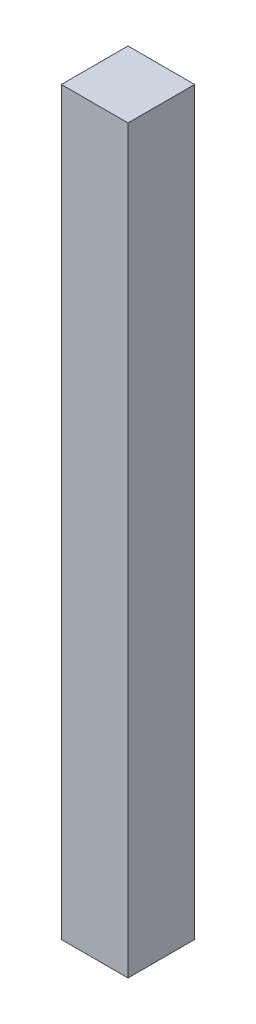
ISO-10303-21;
HEADER;
FILE_DESCRIPTION(('STEP AP214'),'2;1');
FILE_NAME('part.step','',(''),(''),'','','');
FILE_SCHEMA(('AUTOMOTIVE_DESIGN { 1 0 10303 214 1 1 1 1 }'));
ENDSEC;
DATA;
#1=APPLICATION_CONTEXT('core data for automotive mechanical design processes');
#2=APPLICATION_PROTOCOL_DEFINITION('international standard','automotive_design',2000,#1);
#3=PRODUCT_CONTEXT('',#1,'mechanical');
#4=PRODUCT('Part','Part','',(#3));
#5=PRODUCT_RELATED_PRODUCT_CATEGORY('part','',(#4));
#6=PRODUCT_DEFINITION_FORMATION('','',#4);
#7=PRODUCT_DEFINITION_CONTEXT('part definition',#1,'design');
#8=PRODUCT_DEFINITION('design','',#6,#7);
#9=PRODUCT_DEFINITION_SHAPE('','',#8);
#10=(LENGTH_UNIT() NAMED_UNIT(*) SI_UNIT(.MILLI.,.METRE.));
#11=(NAMED_UNIT(*) PLANE_ANGLE_UNIT() SI_UNIT($,.RADIAN.));
#12=(NAMED_UNIT(*) SI_UNIT($,.STERADIAN.) SOLID_ANGLE_UNIT());
#13=UNCERTAINTY_MEASURE_WITH_UNIT(LENGTH_MEASURE(1.E-05),#10,'distance_accuracy_value','');
#14=(GEOMETRIC_REPRESENTATION_CONTEXT(3) GLOBAL_UNCERTAINTY_ASSIGNED_CONTEXT((#13)) GLOBAL_UNIT_ASSIGNED_CONTEXT((#10,
#11,#12)) REPRESENTATION_CONTEXT('',''));
#15=CARTESIAN_POINT('',(0.,0.,0.));
#16=DIRECTION('',(0.,0.,1.));
#17=DIRECTION('',(1.,0.,0.));
#18=AXIS2_PLACEMENT_3D('',#15,#16,#17);
#19=CARTESIAN_POINT('',(45.,230.,26.));
#20=DIRECTION('',(1.,0.,0.));
#21=DIRECTION('',(0.,0.,-1.));
#22=AXIS2_PLACEMENT_3D('',#19,#20,#21);
#23=PLANE('',#22);
#24=DIRECTION('',(0.,-1.,0.));
#25=VECTOR('',#24,1.);
#26=CARTESIAN_POINT('',(45.,230.,8.));
#27=LINE('',#26,#25);
#28=CARTESIAN_POINT('',(45.,430.,8.));
#29=VERTEX_POINT('',#28);
#30=CARTESIAN_POINT('',(45.,230.,8.));
#31=VERTEX_POINT('',#30);
#32=EDGE_CURVE('E102',#29,#31,#27,.T.);
#33=ORIENTED_EDGE('',*,*,#32,.T.);
#34=DIRECTION('',(0.,0.,-1.));
#35=VECTOR('',#34,1.);
#36=CARTESIAN_POINT('',(45.,230.,26.));
#37=LINE('',#36,#35);
#38=CARTESIAN_POINT('',(45.,230.,26.));
#39=VERTEX_POINT('',#38);
#40=EDGE_CURVE('E11',#39,#31,#37,.T.);
#41=ORIENTED_EDGE('',*,*,#40,.F.);
#42=DIRECTION('',(0.,-1.,0.));
#43=VECTOR('',#42,1.);
#44=CARTESIAN_POINT('',(45.,230.,26.));
#45=LINE('',#44,#43);
#46=CARTESIAN_POINT('',(45.,430.,26.));
#47=VERTEX_POINT('',#46);
#48=EDGE_CURVE('E90',#47,#39,#45,.T.);
#49=ORIENTED_EDGE('',*,*,#48,.F.);
#50=DIRECTION('',(0.,0.,-1.));
#51=VECTOR('',#50,1.);
#52=CARTESIAN_POINT('',(45.,430.,26.));
#53=LINE('',#52,#51);
#54=EDGE_CURVE('E98',#47,#29,#53,.T.);
#55=ORIENTED_EDGE('',*,*,#54,.T.);
#56=EDGE_LOOP('',(#33,#41,#49,#55));
#57=FACE_BOUND('',#56,.T.);
#58=ADVANCED_FACE('F39',(#57),#23,.F.);
#59=CARTESIAN_POINT('',(45.,230.,26.));
#60=DIRECTION('',(0.,1.,0.));
#61=DIRECTION('',(0.,0.,1.));
#62=AXIS2_PLACEMENT_3D('',#59,#60,#61);
#63=PLANE('',#62);
#64=DIRECTION('',(1.,0.,0.));
#65=VECTOR('',#64,1.);
#66=CARTESIAN_POINT('',(45.,230.,8.));
#67=LINE('',#66,#65);
#68=CARTESIAN_POINT('',(63.,230.,8.));
#69=VERTEX_POINT('',#68);
#70=EDGE_CURVE('E94',#31,#69,#67,.T.);
#71=ORIENTED_EDGE('',*,*,#70,.T.);
#72=DIRECTION('',(0.,0.,-1.));
#73=VECTOR('',#72,1.);
#74=CARTESIAN_POINT('',(63.,230.,26.));
#75=LINE('',#74,#73);
#76=CARTESIAN_POINT('',(63.,230.,26.));
#77=VERTEX_POINT('',#76);
#78=EDGE_CURVE('E47',#77,#69,#75,.T.);
#79=ORIENTED_EDGE('',*,*,#78,.F.);
#80=DIRECTION('',(1.,0.,0.));
#81=VECTOR('',#80,1.);
#82=CARTESIAN_POINT('',(45.,230.,26.));
#83=LINE('',#82,#81);
#84=EDGE_CURVE('E85',#39,#77,#83,.T.);
#85=ORIENTED_EDGE('',*,*,#84,.F.);
#86=ORIENTED_EDGE('',*,*,#40,.T.);
#87=EDGE_LOOP('',(#71,#79,#85,#86));
#88=FACE_BOUND('',#87,.T.);
#89=ADVANCED_FACE('F93',(#88),#63,.F.);
#90=CARTESIAN_POINT('',(63.,230.,26.));
#91=DIRECTION('',(-1.,0.,0.));
#92=DIRECTION('',(0.,0.,1.));
#93=AXIS2_PLACEMENT_3D('',#90,#91,#92);
#94=PLANE('',#93);
#95=DIRECTION('',(0.,1.,0.));
#96=VECTOR('',#95,1.);
#97=CARTESIAN_POINT('',(63.,230.,8.));
#98=LINE('',#97,#96);
#99=CARTESIAN_POINT('',(63.,430.,8.));
#100=VERTEX_POINT('',#99);
#101=EDGE_CURVE('E72',#69,#100,#98,.T.);
#102=ORIENTED_EDGE('',*,*,#101,.T.);
#103=DIRECTION('',(0.,0.,-1.));
#104=VECTOR('',#103,1.);
#105=CARTESIAN_POINT('',(63.,430.,26.));
#106=LINE('',#105,#104);
#107=CARTESIAN_POINT('',(63.,430.,26.));
#108=VERTEX_POINT('',#107);
#109=EDGE_CURVE('E95',#108,#100,#106,.T.);
#110=ORIENTED_EDGE('',*,*,#109,.F.);
#111=DIRECTION('',(0.,1.,0.));
#112=VECTOR('',#111,1.);
#113=CARTESIAN_POINT('',(63.,230.,26.));
#114=LINE('',#113,#112);
#115=EDGE_CURVE('E88',#77,#108,#114,.T.);
#116=ORIENTED_EDGE('',*,*,#115,.F.);
#117=ORIENTED_EDGE('',*,*,#78,.T.);
#118=EDGE_LOOP('',(#102,#110,#116,#117));
#119=FACE_BOUND('',#118,.T.);
#120=ADVANCED_FACE('F96',(#119),#94,.F.);
#121=CARTESIAN_POINT('',(45.,430.,26.));
#122=DIRECTION('',(0.,-1.,0.));
#123=DIRECTION('',(0.,0.,-1.));
#124=AXIS2_PLACEMENT_3D('',#121,#122,#123);
#125=PLANE('',#124);
#126=DIRECTION('',(-1.,0.,0.));
#127=VECTOR('',#126,1.);
#128=CARTESIAN_POINT('',(45.,430.,8.));
#129=LINE('',#128,#127);
#130=EDGE_CURVE('E78',#100,#29,#129,.T.);
#131=ORIENTED_EDGE('',*,*,#130,.T.);
#132=ORIENTED_EDGE('',*,*,#54,.F.);
#133=DIRECTION('',(-1.,0.,0.));
#134=VECTOR('',#133,1.);
#135=CARTESIAN_POINT('',(45.,430.,26.));
#136=LINE('',#135,#134);
#137=EDGE_CURVE('E55',#108,#47,#136,.T.);
#138=ORIENTED_EDGE('',*,*,#137,.F.);
#139=ORIENTED_EDGE('',*,*,#109,.T.);
#140=EDGE_LOOP('',(#131,#132,#138,#139));
#141=FACE_BOUND('',#140,.T.);
#142=ADVANCED_FACE('F109',(#141),#125,.F.);
#143=CARTESIAN_POINT('',(0.,0.,26.));
#144=DIRECTION('',(0.,0.,-1.));
#145=DIRECTION('',(-1.,0.,0.));
#146=AXIS2_PLACEMENT_3D('',#143,#144,#145);
#147=PLANE('',#146);
#148=ORIENTED_EDGE('',*,*,#48,.T.);
#149=ORIENTED_EDGE('',*,*,#84,.T.);
#150=ORIENTED_EDGE('',*,*,#115,.T.);
#151=ORIENTED_EDGE('',*,*,#137,.T.);
#152=EDGE_LOOP('',(#148,#149,#150,#151));
#153=FACE_BOUND('',#152,.T.);
#154=ADVANCED_FACE('F86',(#153),#147,.F.);
#155=CARTESIAN_POINT('',(0.,0.,8.));
#156=DIRECTION('',(0.,0.,-1.));
#157=DIRECTION('',(-1.,0.,0.));
#158=AXIS2_PLACEMENT_3D('',#155,#156,#157);
#159=PLANE('',#158);
#160=ORIENTED_EDGE('',*,*,#32,.F.);
#161=ORIENTED_EDGE('',*,*,#130,.F.);
#162=ORIENTED_EDGE('',*,*,#101,.F.);
#163=ORIENTED_EDGE('',*,*,#70,.F.);
#164=EDGE_LOOP('',(#160,#161,#162,#163));
#165=FACE_BOUND('',#164,.T.);
#166=ADVANCED_FACE('F112',(#165),#159,.T.);
#167=CLOSED_SHELL('',(#58,#89,#120,#142,#154,#166));
#168=MANIFOLD_SOLID_BREP('B2',#167);
#169=ADVANCED_BREP_SHAPE_REPRESENTATION('',(#18,#168),#14);
#170=SHAPE_DEFINITION_REPRESENTATION(#9,#169);
ENDSEC;
END-ISO-10303-21;
